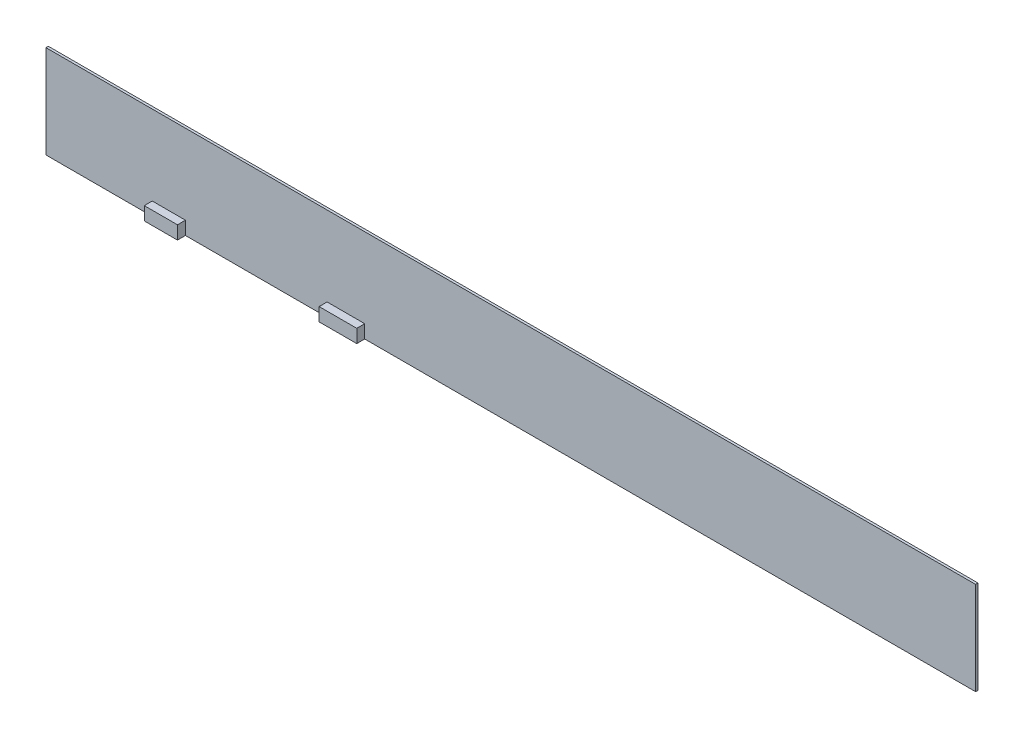
ISO-10303-21;
HEADER;
FILE_DESCRIPTION(('STEP AP214'),'2;1');
FILE_NAME('part.step','',(''),(''),'','','');
FILE_SCHEMA(('AUTOMOTIVE_DESIGN { 1 0 10303 214 1 1 1 1 }'));
ENDSEC;
DATA;
#1=APPLICATION_CONTEXT('core data for automotive mechanical design processes');
#2=APPLICATION_PROTOCOL_DEFINITION('international standard','automotive_design',2000,#1);
#3=PRODUCT_CONTEXT('',#1,'mechanical');
#4=PRODUCT('Part','Part','',(#3));
#5=PRODUCT_RELATED_PRODUCT_CATEGORY('part','',(#4));
#6=PRODUCT_DEFINITION_FORMATION('','',#4);
#7=PRODUCT_DEFINITION_CONTEXT('part definition',#1,'design');
#8=PRODUCT_DEFINITION('design','',#6,#7);
#9=PRODUCT_DEFINITION_SHAPE('','',#8);
#10=(LENGTH_UNIT() NAMED_UNIT(*) SI_UNIT(.MILLI.,.METRE.));
#11=(NAMED_UNIT(*) PLANE_ANGLE_UNIT() SI_UNIT($,.RADIAN.));
#12=(NAMED_UNIT(*) SI_UNIT($,.STERADIAN.) SOLID_ANGLE_UNIT());
#13=UNCERTAINTY_MEASURE_WITH_UNIT(LENGTH_MEASURE(1.E-05),#10,'distance_accuracy_value','');
#14=(GEOMETRIC_REPRESENTATION_CONTEXT(3) GLOBAL_UNCERTAINTY_ASSIGNED_CONTEXT((#13)) GLOBAL_UNIT_ASSIGNED_CONTEXT((#10,
#11,#12)) REPRESENTATION_CONTEXT('',''));
#15=CARTESIAN_POINT('',(0.,0.,0.));
#16=DIRECTION('',(0.,0.,1.));
#17=DIRECTION('',(1.,0.,0.));
#18=AXIS2_PLACEMENT_3D('',#15,#16,#17);
#19=CARTESIAN_POINT('',(0.,0.,5.4));
#20=DIRECTION('',(0.,0.,-1.));
#21=DIRECTION('',(-1.,0.,0.));
#22=AXIS2_PLACEMENT_3D('',#19,#20,#21);
#23=PLANE('',#22);
#24=DIRECTION('',(0.,-1.,0.));
#25=VECTOR('',#24,1.);
#26=CARTESIAN_POINT('',(635.,0.,5.4));
#27=LINE('',#26,#25);
#28=CARTESIAN_POINT('',(635.,30.,5.4));
#29=VERTEX_POINT('',#28);
#30=CARTESIAN_POINT('',(635.,0.,5.4));
#31=VERTEX_POINT('',#30);
#32=EDGE_CURVE('E167',#29,#31,#27,.T.);
#33=ORIENTED_EDGE('',*,*,#32,.F.);
#34=DIRECTION('',(-1.,0.,0.));
#35=VECTOR('',#34,1.);
#36=CARTESIAN_POINT('',(635.,30.,5.4));
#37=LINE('',#36,#35);
#38=CARTESIAN_POINT('',(720.,30.,5.4));
#39=VERTEX_POINT('',#38);
#40=EDGE_CURVE('E180',#39,#29,#37,.T.);
#41=ORIENTED_EDGE('',*,*,#40,.F.);
#42=DIRECTION('',(0.,1.,0.));
#43=VECTOR('',#42,1.);
#44=CARTESIAN_POINT('',(720.,0.,5.4));
#45=LINE('',#44,#43);
#46=CARTESIAN_POINT('',(720.,0.,5.4));
#47=VERTEX_POINT('',#46);
#48=EDGE_CURVE('E170',#47,#39,#45,.T.);
#49=ORIENTED_EDGE('',*,*,#48,.F.);
#50=DIRECTION('',(1.,0.,0.));
#51=VECTOR('',#50,1.);
#52=CARTESIAN_POINT('',(0.,0.,5.4));
#53=LINE('',#52,#51);
#54=CARTESIAN_POINT('',(2100.,0.,5.4));
#55=VERTEX_POINT('',#54);
#56=EDGE_CURVE('E236',#47,#55,#53,.T.);
#57=ORIENTED_EDGE('',*,*,#56,.T.);
#58=DIRECTION('',(0.,1.,0.));
#59=VECTOR('',#58,1.);
#60=CARTESIAN_POINT('',(2100.,0.,5.4));
#61=LINE('',#60,#59);
#62=CARTESIAN_POINT('',(2100.,210.,5.4));
#63=VERTEX_POINT('',#62);
#64=EDGE_CURVE('E240',#55,#63,#61,.T.);
#65=ORIENTED_EDGE('',*,*,#64,.T.);
#66=DIRECTION('',(-1.,0.,0.));
#67=VECTOR('',#66,1.);
#68=CARTESIAN_POINT('',(0.,210.,5.4));
#69=LINE('',#68,#67);
#70=CARTESIAN_POINT('',(0.,210.,5.4));
#71=VERTEX_POINT('',#70);
#72=EDGE_CURVE('E243',#63,#71,#69,.T.);
#73=ORIENTED_EDGE('',*,*,#72,.T.);
#74=DIRECTION('',(0.,-1.,0.));
#75=VECTOR('',#74,1.);
#76=CARTESIAN_POINT('',(0.,0.,5.4));
#77=LINE('',#76,#75);
#78=CARTESIAN_POINT('',(0.,0.,5.4));
#79=VERTEX_POINT('',#78);
#80=EDGE_CURVE('E233',#71,#79,#77,.T.);
#81=ORIENTED_EDGE('',*,*,#80,.T.);
#82=CARTESIAN_POINT('',(240.,0.,5.4));
#83=VERTEX_POINT('',#82);
#84=EDGE_CURVE('E238',#79,#83,#53,.T.);
#85=ORIENTED_EDGE('',*,*,#84,.T.);
#86=DIRECTION('',(0.,-1.,0.));
#87=VECTOR('',#86,1.);
#88=CARTESIAN_POINT('',(240.,0.,5.4));
#89=LINE('',#88,#87);
#90=CARTESIAN_POINT('',(240.,30.,5.4));
#91=VERTEX_POINT('',#90);
#92=EDGE_CURVE('E202',#91,#83,#89,.T.);
#93=ORIENTED_EDGE('',*,*,#92,.F.);
#94=DIRECTION('',(-1.,0.,0.));
#95=VECTOR('',#94,1.);
#96=CARTESIAN_POINT('',(240.,30.,5.4));
#97=LINE('',#96,#95);
#98=CARTESIAN_POINT('',(315.,30.,5.4));
#99=VERTEX_POINT('',#98);
#100=EDGE_CURVE('E207',#99,#91,#97,.T.);
#101=ORIENTED_EDGE('',*,*,#100,.F.);
#102=DIRECTION('',(0.,1.,0.));
#103=VECTOR('',#102,1.);
#104=CARTESIAN_POINT('',(315.,0.,5.4));
#105=LINE('',#104,#103);
#106=CARTESIAN_POINT('',(315.,0.,5.4));
#107=VERTEX_POINT('',#106);
#108=EDGE_CURVE('E216',#107,#99,#105,.T.);
#109=ORIENTED_EDGE('',*,*,#108,.F.);
#110=EDGE_CURVE('E241',#107,#31,#53,.T.);
#111=ORIENTED_EDGE('',*,*,#110,.T.);
#112=EDGE_LOOP('',(#33,#41,#49,#57,#65,#73,#81,#85,#93,#101,#109,#111));
#113=FACE_BOUND('',#112,.T.);
#114=ADVANCED_FACE('F34',(#113),#23,.F.);
#115=CARTESIAN_POINT('',(0.,0.,5.4));
#116=DIRECTION('',(1.,0.,0.));
#117=DIRECTION('',(0.,0.,-1.));
#118=AXIS2_PLACEMENT_3D('',#115,#116,#117);
#119=PLANE('',#118);
#120=DIRECTION('',(0.,-1.,0.));
#121=VECTOR('',#120,1.);
#122=CARTESIAN_POINT('',(0.,0.,0.));
#123=LINE('',#122,#121);
#124=CARTESIAN_POINT('',(0.,210.,0.));
#125=VERTEX_POINT('',#124);
#126=CARTESIAN_POINT('',(0.,0.,0.));
#127=VERTEX_POINT('',#126);
#128=EDGE_CURVE('E232',#125,#127,#123,.T.);
#129=ORIENTED_EDGE('',*,*,#128,.T.);
#130=DIRECTION('',(0.,0.,-1.));
#131=VECTOR('',#130,1.);
#132=CARTESIAN_POINT('',(0.,0.,5.4));
#133=LINE('',#132,#131);
#134=EDGE_CURVE('E11',#79,#127,#133,.T.);
#135=ORIENTED_EDGE('',*,*,#134,.F.);
#136=ORIENTED_EDGE('',*,*,#80,.F.);
#137=DIRECTION('',(0.,0.,-1.));
#138=VECTOR('',#137,1.);
#139=CARTESIAN_POINT('',(0.,210.,5.4));
#140=LINE('',#139,#138);
#141=EDGE_CURVE('E245',#71,#125,#140,.T.);
#142=ORIENTED_EDGE('',*,*,#141,.T.);
#143=EDGE_LOOP('',(#129,#135,#136,#142));
#144=FACE_BOUND('',#143,.T.);
#145=ADVANCED_FACE('F36',(#144),#119,.F.);
#146=CARTESIAN_POINT('',(0.,0.,5.4));
#147=DIRECTION('',(0.,1.,0.));
#148=DIRECTION('',(0.,0.,1.));
#149=AXIS2_PLACEMENT_3D('',#146,#147,#148);
#150=PLANE('',#149);
#151=DIRECTION('',(1.,0.,0.));
#152=VECTOR('',#151,1.);
#153=CARTESIAN_POINT('',(0.,0.,0.));
#154=LINE('',#153,#152);
#155=CARTESIAN_POINT('',(2100.,0.,0.));
#156=VERTEX_POINT('',#155);
#157=EDGE_CURVE('E248',#127,#156,#154,.T.);
#158=ORIENTED_EDGE('',*,*,#157,.T.);
#159=DIRECTION('',(0.,0.,-1.));
#160=VECTOR('',#159,1.);
#161=CARTESIAN_POINT('',(2100.,0.,5.4));
#162=LINE('',#161,#160);
#163=EDGE_CURVE('E42',#55,#156,#162,.T.);
#164=ORIENTED_EDGE('',*,*,#163,.F.);
#165=ORIENTED_EDGE('',*,*,#56,.F.);
#166=DIRECTION('',(0.,0.,-1.));
#167=VECTOR('',#166,1.);
#168=CARTESIAN_POINT('',(720.,0.,23.4));
#169=LINE('',#168,#167);
#170=CARTESIAN_POINT('',(720.,0.,23.4));
#171=VERTEX_POINT('',#170);
#172=EDGE_CURVE('E196',#171,#47,#169,.T.);
#173=ORIENTED_EDGE('',*,*,#172,.F.);
#174=DIRECTION('',(1.,0.,0.));
#175=VECTOR('',#174,1.);
#176=CARTESIAN_POINT('',(635.,0.,23.4));
#177=LINE('',#176,#175);
#178=CARTESIAN_POINT('',(635.,0.,23.4));
#179=VERTEX_POINT('',#178);
#180=EDGE_CURVE('E179',#179,#171,#177,.T.);
#181=ORIENTED_EDGE('',*,*,#180,.F.);
#182=DIRECTION('',(0.,0.,-1.));
#183=VECTOR('',#182,1.);
#184=CARTESIAN_POINT('',(635.,0.,23.4));
#185=LINE('',#184,#183);
#186=EDGE_CURVE('E199',#179,#31,#185,.T.);
#187=ORIENTED_EDGE('',*,*,#186,.T.);
#188=ORIENTED_EDGE('',*,*,#110,.F.);
#189=DIRECTION('',(0.,0.,-1.));
#190=VECTOR('',#189,1.);
#191=CARTESIAN_POINT('',(315.,0.,23.4));
#192=LINE('',#191,#190);
#193=CARTESIAN_POINT('',(315.,0.,23.4));
#194=VERTEX_POINT('',#193);
#195=EDGE_CURVE('E226',#194,#107,#192,.T.);
#196=ORIENTED_EDGE('',*,*,#195,.F.);
#197=DIRECTION('',(1.,0.,0.));
#198=VECTOR('',#197,1.);
#199=CARTESIAN_POINT('',(240.,0.,23.4));
#200=LINE('',#199,#198);
#201=CARTESIAN_POINT('',(240.,0.,23.4));
#202=VERTEX_POINT('',#201);
#203=EDGE_CURVE('E206',#202,#194,#200,.T.);
#204=ORIENTED_EDGE('',*,*,#203,.F.);
#205=DIRECTION('',(0.,0.,-1.));
#206=VECTOR('',#205,1.);
#207=CARTESIAN_POINT('',(240.,0.,23.4));
#208=LINE('',#207,#206);
#209=EDGE_CURVE('E229',#202,#83,#208,.T.);
#210=ORIENTED_EDGE('',*,*,#209,.T.);
#211=ORIENTED_EDGE('',*,*,#84,.F.);
#212=ORIENTED_EDGE('',*,*,#134,.T.);
#213=EDGE_LOOP('',(#158,#164,#165,#173,#181,#187,#188,#196,#204,#210,#211,#212));
#214=FACE_BOUND('',#213,.T.);
#215=ADVANCED_FACE('F282',(#214),#150,.F.);
#216=CARTESIAN_POINT('',(2100.,0.,5.4));
#217=DIRECTION('',(-1.,0.,0.));
#218=DIRECTION('',(0.,0.,1.));
#219=AXIS2_PLACEMENT_3D('',#216,#217,#218);
#220=PLANE('',#219);
#221=DIRECTION('',(0.,1.,0.));
#222=VECTOR('',#221,1.);
#223=CARTESIAN_POINT('',(2100.,0.,0.));
#224=LINE('',#223,#222);
#225=CARTESIAN_POINT('',(2100.,210.,0.));
#226=VERTEX_POINT('',#225);
#227=EDGE_CURVE('E250',#156,#226,#224,.T.);
#228=ORIENTED_EDGE('',*,*,#227,.T.);
#229=DIRECTION('',(0.,0.,-1.));
#230=VECTOR('',#229,1.);
#231=CARTESIAN_POINT('',(2100.,210.,5.4));
#232=LINE('',#231,#230);
#233=EDGE_CURVE('E255',#63,#226,#232,.T.);
#234=ORIENTED_EDGE('',*,*,#233,.F.);
#235=ORIENTED_EDGE('',*,*,#64,.F.);
#236=ORIENTED_EDGE('',*,*,#163,.T.);
#237=EDGE_LOOP('',(#228,#234,#235,#236));
#238=FACE_BOUND('',#237,.T.);
#239=ADVANCED_FACE('F262',(#238),#220,.F.);
#240=CARTESIAN_POINT('',(0.,210.,5.4));
#241=DIRECTION('',(0.,-1.,0.));
#242=DIRECTION('',(0.,0.,-1.));
#243=AXIS2_PLACEMENT_3D('',#240,#241,#242);
#244=PLANE('',#243);
#245=DIRECTION('',(-1.,0.,0.));
#246=VECTOR('',#245,1.);
#247=CARTESIAN_POINT('',(0.,210.,0.));
#248=LINE('',#247,#246);
#249=EDGE_CURVE('E237',#226,#125,#248,.T.);
#250=ORIENTED_EDGE('',*,*,#249,.T.);
#251=ORIENTED_EDGE('',*,*,#141,.F.);
#252=ORIENTED_EDGE('',*,*,#72,.F.);
#253=ORIENTED_EDGE('',*,*,#233,.T.);
#254=EDGE_LOOP('',(#250,#251,#252,#253));
#255=FACE_BOUND('',#254,.T.);
#256=ADVANCED_FACE('F271',(#255),#244,.F.);
#257=CARTESIAN_POINT('',(0.,0.,0.));
#258=DIRECTION('',(0.,0.,-1.));
#259=DIRECTION('',(-1.,0.,0.));
#260=AXIS2_PLACEMENT_3D('',#257,#258,#259);
#261=PLANE('',#260);
#262=DIRECTION('',(0.,-1.,0.));
#263=VECTOR('',#262,1.);
#264=CARTESIAN_POINT('',(2034.,18.,0.));
#265=LINE('',#264,#263);
#266=CARTESIAN_POINT('',(2034.,200.,0.));
#267=VERTEX_POINT('',#266);
#268=CARTESIAN_POINT('',(2034.,18.,0.));
#269=VERTEX_POINT('',#268);
#270=EDGE_CURVE('E49',#267,#269,#265,.T.);
#271=ORIENTED_EDGE('',*,*,#270,.F.);
#272=DIRECTION('',(1.,0.,0.));
#273=VECTOR('',#272,1.);
#274=CARTESIAN_POINT('',(2034.,200.,0.));
#275=LINE('',#274,#273);
#276=CARTESIAN_POINT('',(66.0000000000001,200.,0.));
#277=VERTEX_POINT('',#276);
#278=EDGE_CURVE('E53',#277,#267,#275,.T.);
#279=ORIENTED_EDGE('',*,*,#278,.F.);
#280=DIRECTION('',(0.,1.,0.));
#281=VECTOR('',#280,1.);
#282=CARTESIAN_POINT('',(66.0000000000001,18.,0.));
#283=LINE('',#282,#281);
#284=CARTESIAN_POINT('',(66.0000000000001,18.,0.));
#285=VERTEX_POINT('',#284);
#286=EDGE_CURVE('E433',#285,#277,#283,.T.);
#287=ORIENTED_EDGE('',*,*,#286,.F.);
#288=DIRECTION('',(-1.,0.,0.));
#289=VECTOR('',#288,1.);
#290=CARTESIAN_POINT('',(2034.,18.,0.));
#291=LINE('',#290,#289);
#292=EDGE_CURVE('E439',#269,#285,#291,.T.);
#293=ORIENTED_EDGE('',*,*,#292,.F.);
#294=EDGE_LOOP('',(#271,#279,#287,#293));
#295=FACE_BOUND('',#294,.T.);
#296=ORIENTED_EDGE('',*,*,#128,.F.);
#297=ORIENTED_EDGE('',*,*,#249,.F.);
#298=ORIENTED_EDGE('',*,*,#227,.F.);
#299=ORIENTED_EDGE('',*,*,#157,.F.);
#300=EDGE_LOOP('',(#296,#297,#298,#299));
#301=FACE_BOUND('',#300,.T.);
#302=ADVANCED_FACE('F268',(#295,#301),#261,.T.);
#303=CARTESIAN_POINT('',(240.,0.,23.4));
#304=DIRECTION('',(1.,0.,0.));
#305=DIRECTION('',(0.,0.,-1.));
#306=AXIS2_PLACEMENT_3D('',#303,#304,#305);
#307=PLANE('',#306);
#308=ORIENTED_EDGE('',*,*,#92,.T.);
#309=ORIENTED_EDGE('',*,*,#209,.F.);
#310=DIRECTION('',(0.,-1.,0.));
#311=VECTOR('',#310,1.);
#312=CARTESIAN_POINT('',(240.,0.,23.4));
#313=LINE('',#312,#311);
#314=CARTESIAN_POINT('',(240.,30.,23.4));
#315=VERTEX_POINT('',#314);
#316=EDGE_CURVE('E203',#315,#202,#313,.T.);
#317=ORIENTED_EDGE('',*,*,#316,.F.);
#318=DIRECTION('',(0.,0.,-1.));
#319=VECTOR('',#318,1.);
#320=CARTESIAN_POINT('',(240.,30.,23.4));
#321=LINE('',#320,#319);
#322=EDGE_CURVE('E213',#315,#91,#321,.T.);
#323=ORIENTED_EDGE('',*,*,#322,.T.);
#324=EDGE_LOOP('',(#308,#309,#317,#323));
#325=FACE_BOUND('',#324,.T.);
#326=ADVANCED_FACE('F311',(#325),#307,.F.);
#327=CARTESIAN_POINT('',(315.,0.,23.4));
#328=DIRECTION('',(-1.,0.,0.));
#329=DIRECTION('',(0.,-1.,0.));
#330=AXIS2_PLACEMENT_3D('',#327,#328,#329);
#331=PLANE('',#330);
#332=ORIENTED_EDGE('',*,*,#108,.T.);
#333=DIRECTION('',(0.,0.,-1.));
#334=VECTOR('',#333,1.);
#335=CARTESIAN_POINT('',(315.,30.,23.4));
#336=LINE('',#335,#334);
#337=CARTESIAN_POINT('',(315.,30.,23.4));
#338=VERTEX_POINT('',#337);
#339=EDGE_CURVE('E223',#338,#99,#336,.T.);
#340=ORIENTED_EDGE('',*,*,#339,.F.);
#341=DIRECTION('',(0.,1.,0.));
#342=VECTOR('',#341,1.);
#343=CARTESIAN_POINT('',(315.,0.,23.4));
#344=LINE('',#343,#342);
#345=EDGE_CURVE('E209',#194,#338,#344,.T.);
#346=ORIENTED_EDGE('',*,*,#345,.F.);
#347=ORIENTED_EDGE('',*,*,#195,.T.);
#348=EDGE_LOOP('',(#332,#340,#346,#347));
#349=FACE_BOUND('',#348,.T.);
#350=ADVANCED_FACE('F342',(#349),#331,.F.);
#351=CARTESIAN_POINT('',(240.,30.,23.4));
#352=DIRECTION('',(0.,-1.,0.));
#353=DIRECTION('',(0.,0.,-1.));
#354=AXIS2_PLACEMENT_3D('',#351,#352,#353);
#355=PLANE('',#354);
#356=ORIENTED_EDGE('',*,*,#100,.T.);
#357=ORIENTED_EDGE('',*,*,#322,.F.);
#358=DIRECTION('',(-1.,0.,0.));
#359=VECTOR('',#358,1.);
#360=CARTESIAN_POINT('',(240.,30.,23.4));
#361=LINE('',#360,#359);
#362=EDGE_CURVE('E211',#338,#315,#361,.T.);
#363=ORIENTED_EDGE('',*,*,#362,.F.);
#364=ORIENTED_EDGE('',*,*,#339,.T.);
#365=EDGE_LOOP('',(#356,#357,#363,#364));
#366=FACE_BOUND('',#365,.T.);
#367=ADVANCED_FACE('F349',(#366),#355,.F.);
#368=CARTESIAN_POINT('',(0.,0.,23.4));
#369=DIRECTION('',(0.,0.,-1.));
#370=DIRECTION('',(-1.,0.,0.));
#371=AXIS2_PLACEMENT_3D('',#368,#369,#370);
#372=PLANE('',#371);
#373=ORIENTED_EDGE('',*,*,#316,.T.);
#374=ORIENTED_EDGE('',*,*,#203,.T.);
#375=ORIENTED_EDGE('',*,*,#345,.T.);
#376=ORIENTED_EDGE('',*,*,#362,.T.);
#377=EDGE_LOOP('',(#373,#374,#375,#376));
#378=FACE_BOUND('',#377,.T.);
#379=ADVANCED_FACE('F356',(#378),#372,.F.);
#380=CARTESIAN_POINT('',(635.,0.,23.4));
#381=DIRECTION('',(1.,0.,0.));
#382=DIRECTION('',(0.,0.,-1.));
#383=AXIS2_PLACEMENT_3D('',#380,#381,#382);
#384=PLANE('',#383);
#385=ORIENTED_EDGE('',*,*,#32,.T.);
#386=ORIENTED_EDGE('',*,*,#186,.F.);
#387=DIRECTION('',(0.,-1.,0.));
#388=VECTOR('',#387,1.);
#389=CARTESIAN_POINT('',(635.,0.,23.4));
#390=LINE('',#389,#388);
#391=CARTESIAN_POINT('',(635.,30.,23.4));
#392=VERTEX_POINT('',#391);
#393=EDGE_CURVE('E176',#392,#179,#390,.T.);
#394=ORIENTED_EDGE('',*,*,#393,.F.);
#395=DIRECTION('',(0.,0.,-1.));
#396=VECTOR('',#395,1.);
#397=CARTESIAN_POINT('',(635.,30.,23.4));
#398=LINE('',#397,#396);
#399=EDGE_CURVE('E185',#392,#29,#398,.T.);
#400=ORIENTED_EDGE('',*,*,#399,.T.);
#401=EDGE_LOOP('',(#385,#386,#394,#400));
#402=FACE_BOUND('',#401,.T.);
#403=ADVANCED_FACE('F285',(#402),#384,.F.);
#404=CARTESIAN_POINT('',(720.,0.,23.4));
#405=DIRECTION('',(-1.,0.,0.));
#406=DIRECTION('',(0.,0.,1.));
#407=AXIS2_PLACEMENT_3D('',#404,#405,#406);
#408=PLANE('',#407);
#409=ORIENTED_EDGE('',*,*,#48,.T.);
#410=DIRECTION('',(0.,0.,-1.));
#411=VECTOR('',#410,1.);
#412=CARTESIAN_POINT('',(720.,30.,23.4));
#413=LINE('',#412,#411);
#414=CARTESIAN_POINT('',(720.,30.,23.4));
#415=VERTEX_POINT('',#414);
#416=EDGE_CURVE('E193',#415,#39,#413,.T.);
#417=ORIENTED_EDGE('',*,*,#416,.F.);
#418=DIRECTION('',(0.,1.,0.));
#419=VECTOR('',#418,1.);
#420=CARTESIAN_POINT('',(720.,0.,23.4));
#421=LINE('',#420,#419);
#422=EDGE_CURVE('E182',#171,#415,#421,.T.);
#423=ORIENTED_EDGE('',*,*,#422,.F.);
#424=ORIENTED_EDGE('',*,*,#172,.T.);
#425=EDGE_LOOP('',(#409,#417,#423,#424));
#426=FACE_BOUND('',#425,.T.);
#427=ADVANCED_FACE('F292',(#426),#408,.F.);
#428=CARTESIAN_POINT('',(635.,30.,23.4));
#429=DIRECTION('',(0.,-1.,0.));
#430=DIRECTION('',(0.,0.,-1.));
#431=AXIS2_PLACEMENT_3D('',#428,#429,#430);
#432=PLANE('',#431);
#433=ORIENTED_EDGE('',*,*,#40,.T.);
#434=ORIENTED_EDGE('',*,*,#399,.F.);
#435=DIRECTION('',(-1.,0.,0.));
#436=VECTOR('',#435,1.);
#437=CARTESIAN_POINT('',(635.,30.,23.4));
#438=LINE('',#437,#436);
#439=EDGE_CURVE('E184',#415,#392,#438,.T.);
#440=ORIENTED_EDGE('',*,*,#439,.F.);
#441=ORIENTED_EDGE('',*,*,#416,.T.);
#442=EDGE_LOOP('',(#433,#434,#440,#441));
#443=FACE_BOUND('',#442,.T.);
#444=ADVANCED_FACE('F289',(#443),#432,.F.);
#445=CARTESIAN_POINT('',(0.,0.,23.4));
#446=DIRECTION('',(0.,0.,-1.));
#447=DIRECTION('',(-1.,0.,0.));
#448=AXIS2_PLACEMENT_3D('',#445,#446,#447);
#449=PLANE('',#448);
#450=ORIENTED_EDGE('',*,*,#393,.T.);
#451=ORIENTED_EDGE('',*,*,#180,.T.);
#452=ORIENTED_EDGE('',*,*,#422,.T.);
#453=ORIENTED_EDGE('',*,*,#439,.T.);
#454=EDGE_LOOP('',(#450,#451,#452,#453));
#455=FACE_BOUND('',#454,.T.);
#456=ADVANCED_FACE('F295',(#455),#449,.F.);
#457=CARTESIAN_POINT('',(2034.,18.,-0.2));
#458=DIRECTION('',(-1.,0.,0.));
#459=DIRECTION('',(0.,0.,1.));
#460=AXIS2_PLACEMENT_3D('',#457,#458,#459);
#461=PLANE('',#460);
#462=ORIENTED_EDGE('',*,*,#270,.T.);
#463=DIRECTION('',(0.,0.,1.));
#464=VECTOR('',#463,1.);
#465=CARTESIAN_POINT('',(2034.,18.,-0.2));
#466=LINE('',#465,#464);
#467=CARTESIAN_POINT('',(2034.,18.,-0.2));
#468=VERTEX_POINT('',#467);
#469=EDGE_CURVE('E150',#468,#269,#466,.T.);
#470=ORIENTED_EDGE('',*,*,#469,.F.);
#471=DIRECTION('',(0.,-1.,0.));
#472=VECTOR('',#471,1.);
#473=CARTESIAN_POINT('',(2034.,18.,-0.2));
#474=LINE('',#473,#472);
#475=CARTESIAN_POINT('',(2034.,200.,-0.2));
#476=VERTEX_POINT('',#475);
#477=EDGE_CURVE('E156',#476,#468,#474,.T.);
#478=ORIENTED_EDGE('',*,*,#477,.F.);
#479=DIRECTION('',(0.,0.,1.));
#480=VECTOR('',#479,1.);
#481=CARTESIAN_POINT('',(2034.,200.,-0.2));
#482=LINE('',#481,#480);
#483=EDGE_CURVE('E431',#476,#267,#482,.T.);
#484=ORIENTED_EDGE('',*,*,#483,.T.);
#485=EDGE_LOOP('',(#462,#470,#478,#484));
#486=FACE_BOUND('',#485,.T.);
#487=ADVANCED_FACE('F166',(#486),#461,.F.);
#488=CARTESIAN_POINT('',(2034.,18.,-0.2));
#489=DIRECTION('',(0.,1.,0.));
#490=DIRECTION('',(0.,0.,1.));
#491=AXIS2_PLACEMENT_3D('',#488,#489,#490);
#492=PLANE('',#491);
#493=ORIENTED_EDGE('',*,*,#292,.T.);
#494=DIRECTION('',(0.,0.,1.));
#495=VECTOR('',#494,1.);
#496=CARTESIAN_POINT('',(66.0000000000001,18.,-0.2));
#497=LINE('',#496,#495);
#498=CARTESIAN_POINT('',(66.0000000000001,18.,-0.2));
#499=VERTEX_POINT('',#498);
#500=EDGE_CURVE('E152',#499,#285,#497,.T.);
#501=ORIENTED_EDGE('',*,*,#500,.F.);
#502=DIRECTION('',(-1.,0.,0.));
#503=VECTOR('',#502,1.);
#504=CARTESIAN_POINT('',(2034.,18.,-0.2));
#505=LINE('',#504,#503);
#506=EDGE_CURVE('E145',#468,#499,#505,.T.);
#507=ORIENTED_EDGE('',*,*,#506,.F.);
#508=ORIENTED_EDGE('',*,*,#469,.T.);
#509=EDGE_LOOP('',(#493,#501,#507,#508));
#510=FACE_BOUND('',#509,.T.);
#511=ADVANCED_FACE('F148',(#510),#492,.F.);
#512=CARTESIAN_POINT('',(66.0000000000001,18.,-0.2));
#513=DIRECTION('',(1.,0.,0.));
#514=DIRECTION('',(0.,0.,-1.));
#515=AXIS2_PLACEMENT_3D('',#512,#513,#514);
#516=PLANE('',#515);
#517=ORIENTED_EDGE('',*,*,#286,.T.);
#518=DIRECTION('',(0.,0.,1.));
#519=VECTOR('',#518,1.);
#520=CARTESIAN_POINT('',(66.0000000000001,200.,-0.2));
#521=LINE('',#520,#519);
#522=CARTESIAN_POINT('',(66.0000000000001,200.,-0.2));
#523=VERTEX_POINT('',#522);
#524=EDGE_CURVE('E172',#523,#277,#521,.T.);
#525=ORIENTED_EDGE('',*,*,#524,.F.);
#526=DIRECTION('',(0.,1.,0.));
#527=VECTOR('',#526,1.);
#528=CARTESIAN_POINT('',(66.0000000000001,18.,-0.2));
#529=LINE('',#528,#527);
#530=EDGE_CURVE('E155',#499,#523,#529,.T.);
#531=ORIENTED_EDGE('',*,*,#530,.F.);
#532=ORIENTED_EDGE('',*,*,#500,.T.);
#533=EDGE_LOOP('',(#517,#525,#531,#532));
#534=FACE_BOUND('',#533,.T.);
#535=ADVANCED_FACE('F399',(#534),#516,.F.);
#536=CARTESIAN_POINT('',(2034.,200.,-0.2));
#537=DIRECTION('',(0.,-1.,0.));
#538=DIRECTION('',(0.,0.,-1.));
#539=AXIS2_PLACEMENT_3D('',#536,#537,#538);
#540=PLANE('',#539);
#541=ORIENTED_EDGE('',*,*,#278,.T.);
#542=ORIENTED_EDGE('',*,*,#483,.F.);
#543=DIRECTION('',(1.,0.,0.));
#544=VECTOR('',#543,1.);
#545=CARTESIAN_POINT('',(2034.,200.,-0.2));
#546=LINE('',#545,#544);
#547=EDGE_CURVE('E161',#523,#476,#546,.T.);
#548=ORIENTED_EDGE('',*,*,#547,.F.);
#549=ORIENTED_EDGE('',*,*,#524,.T.);
#550=EDGE_LOOP('',(#541,#542,#548,#549));
#551=FACE_BOUND('',#550,.T.);
#552=ADVANCED_FACE('F407',(#551),#540,.F.);
#553=CARTESIAN_POINT('',(0.,0.,-0.2));
#554=DIRECTION('',(0.,0.,1.));
#555=DIRECTION('',(1.,0.,0.));
#556=AXIS2_PLACEMENT_3D('',#553,#554,#555);
#557=PLANE('',#556);
#558=ORIENTED_EDGE('',*,*,#477,.T.);
#559=ORIENTED_EDGE('',*,*,#506,.T.);
#560=ORIENTED_EDGE('',*,*,#530,.T.);
#561=ORIENTED_EDGE('',*,*,#547,.T.);
#562=EDGE_LOOP('',(#558,#559,#560,#561));
#563=FACE_BOUND('',#562,.T.);
#564=ADVANCED_FACE('F159',(#563),#557,.F.);
#565=CLOSED_SHELL('',(#114,#145,#215,#239,#256,#302,#326,#350,#367,#379,#403,#427,#444,#456,
#487,#511,#535,#552,#564));
#566=MANIFOLD_SOLID_BREP('B2',#565);
#567=ADVANCED_BREP_SHAPE_REPRESENTATION('',(#18,#566),#14);
#568=SHAPE_DEFINITION_REPRESENTATION(#9,#567);
ENDSEC;
END-ISO-10303-21;
